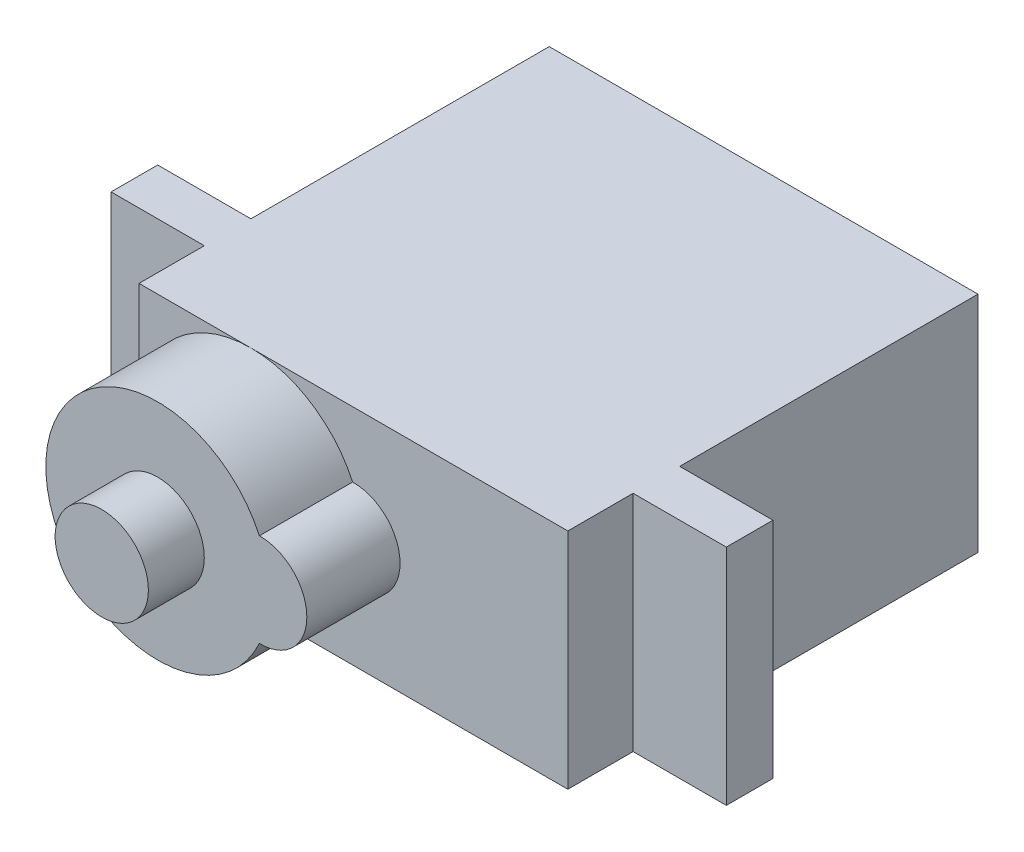
ISO-10303-21;
HEADER;
FILE_DESCRIPTION(('STEP AP214'),'2;1');
FILE_NAME('part.step','',(''),(''),'','','');
FILE_SCHEMA(('AUTOMOTIVE_DESIGN { 1 0 10303 214 1 1 1 1 }'));
ENDSEC;
DATA;
#1=APPLICATION_CONTEXT('core data for automotive mechanical design processes');
#2=APPLICATION_PROTOCOL_DEFINITION('international standard','automotive_design',2000,#1);
#3=PRODUCT_CONTEXT('',#1,'mechanical');
#4=PRODUCT('Part','Part','',(#3));
#5=PRODUCT_RELATED_PRODUCT_CATEGORY('part','',(#4));
#6=PRODUCT_DEFINITION_FORMATION('','',#4);
#7=PRODUCT_DEFINITION_CONTEXT('part definition',#1,'design');
#8=PRODUCT_DEFINITION('design','',#6,#7);
#9=PRODUCT_DEFINITION_SHAPE('','',#8);
#10=(LENGTH_UNIT() NAMED_UNIT(*) SI_UNIT(.MILLI.,.METRE.));
#11=(NAMED_UNIT(*) PLANE_ANGLE_UNIT() SI_UNIT($,.RADIAN.));
#12=(NAMED_UNIT(*) SI_UNIT($,.STERADIAN.) SOLID_ANGLE_UNIT());
#13=UNCERTAINTY_MEASURE_WITH_UNIT(LENGTH_MEASURE(1.E-05),#10,'distance_accuracy_value','');
#14=(GEOMETRIC_REPRESENTATION_CONTEXT(3) GLOBAL_UNCERTAINTY_ASSIGNED_CONTEXT((#13)) GLOBAL_UNIT_ASSIGNED_CONTEXT((#10,
#11,#12)) REPRESENTATION_CONTEXT('',''));
#15=CARTESIAN_POINT('',(0.,0.,0.));
#16=DIRECTION('',(0.,0.,1.));
#17=DIRECTION('',(1.,0.,0.));
#18=AXIS2_PLACEMENT_3D('',#15,#16,#17);
#19=CARTESIAN_POINT('',(11.5,-6.,22.));
#20=DIRECTION('',(-1.,0.,0.));
#21=DIRECTION('',(0.,0.,1.));
#22=AXIS2_PLACEMENT_3D('',#19,#20,#21);
#23=PLANE('',#22);
#24=DIRECTION('',(0.,0.,-1.));
#25=VECTOR('',#24,1.);
#26=CARTESIAN_POINT('',(11.5,-6.,22.));
#27=LINE('',#26,#25);
#28=CARTESIAN_POINT('',(11.5,-6.,22.));
#29=VERTEX_POINT('',#28);
#30=CARTESIAN_POINT('',(11.5,-6.,18.5));
#31=VERTEX_POINT('',#30);
#32=EDGE_CURVE('E253',#29,#31,#27,.T.);
#33=ORIENTED_EDGE('',*,*,#32,.T.);
#34=DIRECTION('',(0.,1.,0.));
#35=VECTOR('',#34,1.);
#36=CARTESIAN_POINT('',(11.5,6.,18.5));
#37=LINE('',#36,#35);
#38=CARTESIAN_POINT('',(11.5,6.,18.5));
#39=VERTEX_POINT('',#38);
#40=EDGE_CURVE('E155',#31,#39,#37,.T.);
#41=ORIENTED_EDGE('',*,*,#40,.T.);
#42=DIRECTION('',(0.,0.,-1.));
#43=VECTOR('',#42,1.);
#44=CARTESIAN_POINT('',(11.5,6.,22.));
#45=LINE('',#44,#43);
#46=CARTESIAN_POINT('',(11.5,6.,22.));
#47=VERTEX_POINT('',#46);
#48=EDGE_CURVE('E39',#47,#39,#45,.T.);
#49=ORIENTED_EDGE('',*,*,#48,.F.);
#50=DIRECTION('',(0.,1.,0.));
#51=VECTOR('',#50,1.);
#52=CARTESIAN_POINT('',(11.5,-6.,22.));
#53=LINE('',#52,#51);
#54=EDGE_CURVE('E227',#29,#47,#53,.T.);
#55=ORIENTED_EDGE('',*,*,#54,.F.);
#56=EDGE_LOOP('',(#33,#41,#49,#55));
#57=FACE_BOUND('',#56,.T.);
#58=ADVANCED_FACE('F35',(#57),#23,.F.);
#59=CARTESIAN_POINT('',(-11.5,-6.,22.));
#60=DIRECTION('',(1.,0.,0.));
#61=DIRECTION('',(0.,0.,-1.));
#62=AXIS2_PLACEMENT_3D('',#59,#60,#61);
#63=PLANE('',#62);
#64=DIRECTION('',(0.,1.,0.));
#65=VECTOR('',#64,1.);
#66=CARTESIAN_POINT('',(-11.5,6.,18.5));
#67=LINE('',#66,#65);
#68=CARTESIAN_POINT('',(-11.5,-6.,18.5));
#69=VERTEX_POINT('',#68);
#70=CARTESIAN_POINT('',(-11.5,6.,18.5));
#71=VERTEX_POINT('',#70);
#72=EDGE_CURVE('E159',#69,#71,#67,.T.);
#73=ORIENTED_EDGE('',*,*,#72,.F.);
#74=DIRECTION('',(0.,0.,-1.));
#75=VECTOR('',#74,1.);
#76=CARTESIAN_POINT('',(-11.5,-6.,22.));
#77=LINE('',#76,#75);
#78=CARTESIAN_POINT('',(-11.5,-6.,22.));
#79=VERTEX_POINT('',#78);
#80=EDGE_CURVE('E256',#79,#69,#77,.T.);
#81=ORIENTED_EDGE('',*,*,#80,.F.);
#82=DIRECTION('',(0.,-1.,0.));
#83=VECTOR('',#82,1.);
#84=CARTESIAN_POINT('',(-11.5,-6.,22.));
#85=LINE('',#84,#83);
#86=CARTESIAN_POINT('',(-11.5,0.,22.));
#87=VERTEX_POINT('',#86);
#88=EDGE_CURVE('E235',#87,#79,#85,.T.);
#89=ORIENTED_EDGE('',*,*,#88,.F.);
#90=CARTESIAN_POINT('',(-11.5,6.,22.));
#91=VERTEX_POINT('',#90);
#92=EDGE_CURVE('E236',#91,#87,#85,.T.);
#93=ORIENTED_EDGE('',*,*,#92,.F.);
#94=DIRECTION('',(0.,0.,-1.));
#95=VECTOR('',#94,1.);
#96=CARTESIAN_POINT('',(-11.5,6.,22.));
#97=LINE('',#96,#95);
#98=EDGE_CURVE('E259',#91,#71,#97,.T.);
#99=ORIENTED_EDGE('',*,*,#98,.T.);
#100=EDGE_LOOP('',(#73,#81,#89,#93,#99));
#101=FACE_BOUND('',#100,.T.);
#102=ADVANCED_FACE('F325',(#101),#63,.F.);
#103=DIRECTION('',(0.,-1.,0.));
#104=VECTOR('',#103,1.);
#105=CARTESIAN_POINT('',(-11.5,6.,16.));
#106=LINE('',#105,#104);
#107=CARTESIAN_POINT('',(-11.5,6.,16.));
#108=VERTEX_POINT('',#107);
#109=CARTESIAN_POINT('',(-11.5,-6.,16.));
#110=VERTEX_POINT('',#109);
#111=EDGE_CURVE('E189',#108,#110,#106,.T.);
#112=ORIENTED_EDGE('',*,*,#111,.F.);
#113=CARTESIAN_POINT('',(-11.5,6.,0.));
#114=VERTEX_POINT('',#113);
#115=EDGE_CURVE('E258',#108,#114,#97,.T.);
#116=ORIENTED_EDGE('',*,*,#115,.T.);
#117=DIRECTION('',(0.,-1.,0.));
#118=VECTOR('',#117,1.);
#119=CARTESIAN_POINT('',(-11.5,-6.,0.));
#120=LINE('',#119,#118);
#121=CARTESIAN_POINT('',(-11.5,-6.,0.));
#122=VERTEX_POINT('',#121);
#123=EDGE_CURVE('E249',#114,#122,#120,.T.);
#124=ORIENTED_EDGE('',*,*,#123,.T.);
#125=EDGE_CURVE('E255',#110,#122,#77,.T.);
#126=ORIENTED_EDGE('',*,*,#125,.F.);
#127=EDGE_LOOP('',(#112,#116,#124,#126));
#128=FACE_BOUND('',#127,.T.);
#129=ADVANCED_FACE('F269',(#128),#63,.F.);
#130=CARTESIAN_POINT('',(0.,0.,22.));
#131=DIRECTION('',(0.,0.,-1.));
#132=DIRECTION('',(-1.,0.,0.));
#133=AXIS2_PLACEMENT_3D('',#130,#131,#132);
#134=PLANE('',#133);
#135=CARTESIAN_POINT('',(-5.5,0.,22.));
#136=DIRECTION('',(0.,0.,1.));
#137=DIRECTION('',(1.,0.,0.));
#138=AXIS2_PLACEMENT_3D('',#135,#136,#137);
#139=CIRCLE('',#138,6.);
#140=CARTESIAN_POINT('',(-0.0454545454545473,2.49958674270319,22.));
#141=VERTEX_POINT('',#140);
#142=CARTESIAN_POINT('',(-5.5,6.,22.));
#143=VERTEX_POINT('',#142);
#144=EDGE_CURVE('E207',#141,#143,#139,.T.);
#145=ORIENTED_EDGE('',*,*,#144,.F.);
#146=CARTESIAN_POINT('',(0.,0.,22.));
#147=DIRECTION('',(0.,0.,1.));
#148=DIRECTION('',(1.,0.,0.));
#149=AXIS2_PLACEMENT_3D('',#146,#147,#148);
#150=CIRCLE('',#149,2.5);
#151=CARTESIAN_POINT('',(-0.0454545454545473,-2.49958674270319,22.));
#152=VERTEX_POINT('',#151);
#153=EDGE_CURVE('E213',#152,#141,#150,.T.);
#154=ORIENTED_EDGE('',*,*,#153,.F.);
#155=CARTESIAN_POINT('',(-5.5,-6.,22.));
#156=VERTEX_POINT('',#155);
#157=EDGE_CURVE('E218',#156,#152,#139,.T.);
#158=ORIENTED_EDGE('',*,*,#157,.F.);
#159=DIRECTION('',(1.,0.,0.));
#160=VECTOR('',#159,1.);
#161=CARTESIAN_POINT('',(-11.5,-6.,22.));
#162=LINE('',#161,#160);
#163=EDGE_CURVE('E239',#156,#29,#162,.T.);
#164=ORIENTED_EDGE('',*,*,#163,.T.);
#165=ORIENTED_EDGE('',*,*,#54,.T.);
#166=DIRECTION('',(-1.,0.,0.));
#167=VECTOR('',#166,1.);
#168=CARTESIAN_POINT('',(-11.5,6.,22.));
#169=LINE('',#168,#167);
#170=EDGE_CURVE('E232',#47,#143,#169,.T.);
#171=ORIENTED_EDGE('',*,*,#170,.T.);
#172=EDGE_LOOP('',(#145,#154,#158,#164,#165,#171));
#173=FACE_BOUND('',#172,.T.);
#174=ADVANCED_FACE('F304',(#173),#134,.F.);
#175=EDGE_CURVE('E44',#143,#87,#139,.T.);
#176=ORIENTED_EDGE('',*,*,#175,.F.);
#177=EDGE_CURVE('E230',#143,#91,#169,.T.);
#178=ORIENTED_EDGE('',*,*,#177,.T.);
#179=ORIENTED_EDGE('',*,*,#92,.T.);
#180=EDGE_LOOP('',(#176,#178,#179));
#181=FACE_BOUND('',#180,.T.);
#182=ADVANCED_FACE('F303',(#181),#134,.F.);
#183=CARTESIAN_POINT('',(11.5,6.,16.));
#184=VERTEX_POINT('',#183);
#185=CARTESIAN_POINT('',(11.5,6.,0.));
#186=VERTEX_POINT('',#185);
#187=EDGE_CURVE('E261',#184,#186,#45,.T.);
#188=ORIENTED_EDGE('',*,*,#187,.F.);
#189=DIRECTION('',(0.,-1.,0.));
#190=VECTOR('',#189,1.);
#191=CARTESIAN_POINT('',(11.5,6.,16.));
#192=LINE('',#191,#190);
#193=CARTESIAN_POINT('',(11.5,-6.,16.));
#194=VERTEX_POINT('',#193);
#195=EDGE_CURVE('E168',#184,#194,#192,.T.);
#196=ORIENTED_EDGE('',*,*,#195,.T.);
#197=CARTESIAN_POINT('',(11.5,-6.,0.));
#198=VERTEX_POINT('',#197);
#199=EDGE_CURVE('E243',#194,#198,#27,.T.);
#200=ORIENTED_EDGE('',*,*,#199,.T.);
#201=DIRECTION('',(0.,1.,0.));
#202=VECTOR('',#201,1.);
#203=CARTESIAN_POINT('',(11.5,-6.,0.));
#204=LINE('',#203,#202);
#205=EDGE_CURVE('E226',#198,#186,#204,.T.);
#206=ORIENTED_EDGE('',*,*,#205,.T.);
#207=EDGE_LOOP('',(#188,#196,#200,#206));
#208=FACE_BOUND('',#207,.T.);
#209=ADVANCED_FACE('F37',(#208),#23,.F.);
#210=CARTESIAN_POINT('',(-11.5,6.,22.));
#211=DIRECTION('',(0.,-1.,0.));
#212=DIRECTION('',(0.,0.,-1.));
#213=AXIS2_PLACEMENT_3D('',#210,#211,#212);
#214=PLANE('',#213);
#215=DIRECTION('',(-1.,0.,0.));
#216=VECTOR('',#215,1.);
#217=CARTESIAN_POINT('',(-11.5,6.,0.));
#218=LINE('',#217,#216);
#219=EDGE_CURVE('E246',#186,#114,#218,.T.);
#220=ORIENTED_EDGE('',*,*,#219,.T.);
#221=ORIENTED_EDGE('',*,*,#115,.F.);
#222=DIRECTION('',(1.,0.,0.));
#223=VECTOR('',#222,1.);
#224=CARTESIAN_POINT('',(-16.5,6.,16.));
#225=LINE('',#224,#223);
#226=CARTESIAN_POINT('',(-16.5,6.,16.));
#227=VERTEX_POINT('',#226);
#228=EDGE_CURVE('E201',#227,#108,#225,.T.);
#229=ORIENTED_EDGE('',*,*,#228,.F.);
#230=DIRECTION('',(0.,0.,-1.));
#231=VECTOR('',#230,1.);
#232=CARTESIAN_POINT('',(-16.5,6.,18.5));
#233=LINE('',#232,#231);
#234=CARTESIAN_POINT('',(-16.5,6.,18.5));
#235=VERTEX_POINT('',#234);
#236=EDGE_CURVE('E188',#235,#227,#233,.T.);
#237=ORIENTED_EDGE('',*,*,#236,.F.);
#238=DIRECTION('',(1.,0.,0.));
#239=VECTOR('',#238,1.);
#240=CARTESIAN_POINT('',(-16.5,6.,18.5));
#241=LINE('',#240,#239);
#242=EDGE_CURVE('E203',#235,#71,#241,.T.);
#243=ORIENTED_EDGE('',*,*,#242,.T.);
#244=ORIENTED_EDGE('',*,*,#98,.F.);
#245=ORIENTED_EDGE('',*,*,#177,.F.);
#246=ORIENTED_EDGE('',*,*,#170,.F.);
#247=ORIENTED_EDGE('',*,*,#48,.T.);
#248=DIRECTION('',(-1.,0.,0.));
#249=VECTOR('',#248,1.);
#250=CARTESIAN_POINT('',(16.5,6.,18.5));
#251=LINE('',#250,#249);
#252=CARTESIAN_POINT('',(16.5,6.,18.5));
#253=VERTEX_POINT('',#252);
#254=EDGE_CURVE('E178',#253,#39,#251,.T.);
#255=ORIENTED_EDGE('',*,*,#254,.F.);
#256=DIRECTION('',(0.,0.,-1.));
#257=VECTOR('',#256,1.);
#258=CARTESIAN_POINT('',(16.5,6.,18.5));
#259=LINE('',#258,#257);
#260=CARTESIAN_POINT('',(16.5,6.,16.));
#261=VERTEX_POINT('',#260);
#262=EDGE_CURVE('E167',#253,#261,#259,.T.);
#263=ORIENTED_EDGE('',*,*,#262,.T.);
#264=DIRECTION('',(-1.,0.,0.));
#265=VECTOR('',#264,1.);
#266=CARTESIAN_POINT('',(16.5,6.,16.));
#267=LINE('',#266,#265);
#268=EDGE_CURVE('E182',#261,#184,#267,.T.);
#269=ORIENTED_EDGE('',*,*,#268,.T.);
#270=ORIENTED_EDGE('',*,*,#187,.T.);
#271=EDGE_LOOP('',(#220,#221,#229,#237,#243,#244,#245,#246,#247,#255,#263,#269,#270));
#272=FACE_BOUND('',#271,.T.);
#273=ADVANCED_FACE('F276',(#272),#214,.F.);
#274=CARTESIAN_POINT('',(-11.5,-6.,22.));
#275=DIRECTION('',(0.,1.,0.));
#276=DIRECTION('',(0.,0.,1.));
#277=AXIS2_PLACEMENT_3D('',#274,#275,#276);
#278=PLANE('',#277);
#279=DIRECTION('',(1.,0.,0.));
#280=VECTOR('',#279,1.);
#281=CARTESIAN_POINT('',(-11.5,-6.,0.));
#282=LINE('',#281,#280);
#283=EDGE_CURVE('E231',#122,#198,#282,.T.);
#284=ORIENTED_EDGE('',*,*,#283,.T.);
#285=ORIENTED_EDGE('',*,*,#199,.F.);
#286=DIRECTION('',(-1.,0.,0.));
#287=VECTOR('',#286,1.);
#288=CARTESIAN_POINT('',(16.5,-6.,16.));
#289=LINE('',#288,#287);
#290=CARTESIAN_POINT('',(16.5,-6.,16.));
#291=VERTEX_POINT('',#290);
#292=EDGE_CURVE('E52',#291,#194,#289,.T.);
#293=ORIENTED_EDGE('',*,*,#292,.F.);
#294=DIRECTION('',(0.,0.,1.));
#295=VECTOR('',#294,1.);
#296=CARTESIAN_POINT('',(16.5,-6.,18.5));
#297=LINE('',#296,#295);
#298=CARTESIAN_POINT('',(16.5,-6.,18.5));
#299=VERTEX_POINT('',#298);
#300=EDGE_CURVE('E165',#291,#299,#297,.T.);
#301=ORIENTED_EDGE('',*,*,#300,.T.);
#302=DIRECTION('',(-1.,0.,0.));
#303=VECTOR('',#302,1.);
#304=CARTESIAN_POINT('',(16.5,-6.,18.5));
#305=LINE('',#304,#303);
#306=EDGE_CURVE('E149',#299,#31,#305,.T.);
#307=ORIENTED_EDGE('',*,*,#306,.T.);
#308=ORIENTED_EDGE('',*,*,#32,.F.);
#309=ORIENTED_EDGE('',*,*,#163,.F.);
#310=EDGE_CURVE('E240',#79,#156,#162,.T.);
#311=ORIENTED_EDGE('',*,*,#310,.F.);
#312=ORIENTED_EDGE('',*,*,#80,.T.);
#313=DIRECTION('',(1.,0.,0.));
#314=VECTOR('',#313,1.);
#315=CARTESIAN_POINT('',(-16.5,-6.,18.5));
#316=LINE('',#315,#314);
#317=CARTESIAN_POINT('',(-16.5,-6.,18.5));
#318=VERTEX_POINT('',#317);
#319=EDGE_CURVE('E195',#318,#69,#316,.T.);
#320=ORIENTED_EDGE('',*,*,#319,.F.);
#321=DIRECTION('',(0.,0.,1.));
#322=VECTOR('',#321,1.);
#323=CARTESIAN_POINT('',(-16.5,-6.,18.5));
#324=LINE('',#323,#322);
#325=CARTESIAN_POINT('',(-16.5,-6.,16.));
#326=VERTEX_POINT('',#325);
#327=EDGE_CURVE('E193',#326,#318,#324,.T.);
#328=ORIENTED_EDGE('',*,*,#327,.F.);
#329=DIRECTION('',(1.,0.,0.));
#330=VECTOR('',#329,1.);
#331=CARTESIAN_POINT('',(-16.5,-6.,16.));
#332=LINE('',#331,#330);
#333=EDGE_CURVE('E60',#326,#110,#332,.T.);
#334=ORIENTED_EDGE('',*,*,#333,.T.);
#335=ORIENTED_EDGE('',*,*,#125,.T.);
#336=EDGE_LOOP('',(#284,#285,#293,#301,#307,#308,#309,#311,#312,#320,#328,#334,#335));
#337=FACE_BOUND('',#336,.T.);
#338=ADVANCED_FACE('F171',(#337),#278,.F.);
#339=EDGE_CURVE('E293',#87,#156,#139,.T.);
#340=ORIENTED_EDGE('',*,*,#339,.F.);
#341=ORIENTED_EDGE('',*,*,#88,.T.);
#342=ORIENTED_EDGE('',*,*,#310,.T.);
#343=EDGE_LOOP('',(#340,#341,#342));
#344=FACE_BOUND('',#343,.T.);
#345=ADVANCED_FACE('F292',(#344),#134,.F.);
#346=CARTESIAN_POINT('',(0.,0.,0.));
#347=DIRECTION('',(0.,0.,-1.));
#348=DIRECTION('',(-1.,0.,0.));
#349=AXIS2_PLACEMENT_3D('',#346,#347,#348);
#350=PLANE('',#349);
#351=ORIENTED_EDGE('',*,*,#205,.F.);
#352=ORIENTED_EDGE('',*,*,#283,.F.);
#353=ORIENTED_EDGE('',*,*,#123,.F.);
#354=ORIENTED_EDGE('',*,*,#219,.F.);
#355=EDGE_LOOP('',(#351,#352,#353,#354));
#356=FACE_BOUND('',#355,.T.);
#357=ADVANCED_FACE('F280',(#356),#350,.T.);
#358=CARTESIAN_POINT('',(-5.5,0.,27.));
#359=DIRECTION('',(0.,0.,-1.));
#360=DIRECTION('',(-1.,0.,0.));
#361=AXIS2_PLACEMENT_3D('',#358,#359,#360);
#362=CYLINDRICAL_SURFACE('',#361,6.);
#363=ORIENTED_EDGE('',*,*,#144,.T.);
#364=ORIENTED_EDGE('',*,*,#175,.T.);
#365=ORIENTED_EDGE('',*,*,#339,.T.);
#366=ORIENTED_EDGE('',*,*,#157,.T.);
#367=DIRECTION('',(0.,0.,-1.));
#368=VECTOR('',#367,1.);
#369=CARTESIAN_POINT('',(-0.0454545454545473,-2.49958674270319,27.));
#370=LINE('',#369,#368);
#371=CARTESIAN_POINT('',(-0.0454545454545473,-2.49958674270319,27.));
#372=VERTEX_POINT('',#371);
#373=EDGE_CURVE('E223',#372,#152,#370,.T.);
#374=ORIENTED_EDGE('',*,*,#373,.F.);
#375=CARTESIAN_POINT('',(-5.5,0.,27.));
#376=DIRECTION('',(0.,0.,1.));
#377=DIRECTION('',(1.,0.,0.));
#378=AXIS2_PLACEMENT_3D('',#375,#376,#377);
#379=CIRCLE('',#378,6.);
#380=CARTESIAN_POINT('',(-0.0454545454545473,2.49958674270319,27.));
#381=VERTEX_POINT('',#380);
#382=EDGE_CURVE('E209',#381,#372,#379,.T.);
#383=ORIENTED_EDGE('',*,*,#382,.F.);
#384=DIRECTION('',(0.,0.,-1.));
#385=VECTOR('',#384,1.);
#386=CARTESIAN_POINT('',(-0.0454545454545473,2.49958674270319,27.));
#387=LINE('',#386,#385);
#388=EDGE_CURVE('E215',#381,#141,#387,.T.);
#389=ORIENTED_EDGE('',*,*,#388,.T.);
#390=EDGE_LOOP('',(#363,#364,#365,#366,#374,#383,#389));
#391=FACE_BOUND('',#390,.T.);
#392=ADVANCED_FACE('F299',(#391),#362,.T.);
#393=CARTESIAN_POINT('',(0.,0.,27.));
#394=DIRECTION('',(0.,0.,-1.));
#395=DIRECTION('',(-1.,0.,0.));
#396=AXIS2_PLACEMENT_3D('',#393,#394,#395);
#397=CYLINDRICAL_SURFACE('',#396,2.5);
#398=ORIENTED_EDGE('',*,*,#153,.T.);
#399=ORIENTED_EDGE('',*,*,#388,.F.);
#400=CARTESIAN_POINT('',(0.,0.,27.));
#401=DIRECTION('',(0.,0.,1.));
#402=DIRECTION('',(1.,0.,0.));
#403=AXIS2_PLACEMENT_3D('',#400,#401,#402);
#404=CIRCLE('',#403,2.5);
#405=EDGE_CURVE('E212',#372,#381,#404,.T.);
#406=ORIENTED_EDGE('',*,*,#405,.F.);
#407=ORIENTED_EDGE('',*,*,#373,.T.);
#408=EDGE_LOOP('',(#398,#399,#406,#407));
#409=FACE_BOUND('',#408,.T.);
#410=ADVANCED_FACE('F307',(#409),#397,.T.);
#411=CARTESIAN_POINT('',(0.,0.,27.));
#412=DIRECTION('',(0.,0.,1.));
#413=DIRECTION('',(1.,0.,0.));
#414=AXIS2_PLACEMENT_3D('',#411,#412,#413);
#415=PLANE('',#414);
#416=CARTESIAN_POINT('',(-5.5,0.,27.));
#417=DIRECTION('',(0.,0.,1.));
#418=DIRECTION('',(1.,0.,0.));
#419=AXIS2_PLACEMENT_3D('',#416,#417,#418);
#420=CIRCLE('',#419,2.5);
#421=CARTESIAN_POINT('',(-3.,0.,27.));
#422=VERTEX_POINT('',#421);
#423=EDGE_CURVE('E11',#422,#422,#420,.T.);
#424=ORIENTED_EDGE('',*,*,#423,.F.);
#425=EDGE_LOOP('',(#424));
#426=FACE_BOUND('',#425,.T.);
#427=ORIENTED_EDGE('',*,*,#382,.T.);
#428=ORIENTED_EDGE('',*,*,#405,.T.);
#429=EDGE_LOOP('',(#427,#428));
#430=FACE_BOUND('',#429,.T.);
#431=ADVANCED_FACE('F310',(#426,#430),#415,.T.);
#432=CARTESIAN_POINT('',(-5.5,0.,30.));
#433=DIRECTION('',(0.,0.,-1.));
#434=DIRECTION('',(-1.,0.,0.));
#435=AXIS2_PLACEMENT_3D('',#432,#433,#434);
#436=CYLINDRICAL_SURFACE('',#435,2.5);
#437=CARTESIAN_POINT('',(-5.5,0.,30.));
#438=DIRECTION('',(0.,0.,1.));
#439=DIRECTION('',(1.,0.,0.));
#440=AXIS2_PLACEMENT_3D('',#437,#438,#439);
#441=CIRCLE('',#440,2.5);
#442=CARTESIAN_POINT('',(-3.,0.,30.));
#443=VERTEX_POINT('',#442);
#444=EDGE_CURVE('E205',#443,#443,#441,.T.);
#445=ORIENTED_EDGE('',*,*,#444,.F.);
#446=EDGE_LOOP('',(#445));
#447=FACE_BOUND('',#446,.T.);
#448=ORIENTED_EDGE('',*,*,#423,.T.);
#449=EDGE_LOOP('',(#448));
#450=FACE_BOUND('',#449,.T.);
#451=ADVANCED_FACE('F312',(#447,#450),#436,.T.);
#452=CARTESIAN_POINT('',(0.,0.,30.));
#453=DIRECTION('',(0.,0.,1.));
#454=DIRECTION('',(1.,0.,0.));
#455=AXIS2_PLACEMENT_3D('',#452,#453,#454);
#456=PLANE('',#455);
#457=ORIENTED_EDGE('',*,*,#444,.T.);
#458=EDGE_LOOP('',(#457));
#459=FACE_BOUND('',#458,.T.);
#460=ADVANCED_FACE('F319',(#459),#456,.T.);
#461=CARTESIAN_POINT('',(-16.5,6.,18.5));
#462=DIRECTION('',(0.,0.,-1.));
#463=DIRECTION('',(-1.,0.,0.));
#464=AXIS2_PLACEMENT_3D('',#461,#462,#463);
#465=PLANE('',#464);
#466=ORIENTED_EDGE('',*,*,#72,.T.);
#467=ORIENTED_EDGE('',*,*,#242,.F.);
#468=DIRECTION('',(0.,1.,0.));
#469=VECTOR('',#468,1.);
#470=CARTESIAN_POINT('',(-16.5,6.,18.5));
#471=LINE('',#470,#469);
#472=EDGE_CURVE('E185',#318,#235,#471,.T.);
#473=ORIENTED_EDGE('',*,*,#472,.F.);
#474=ORIENTED_EDGE('',*,*,#319,.T.);
#475=EDGE_LOOP('',(#466,#467,#473,#474));
#476=FACE_BOUND('',#475,.T.);
#477=ADVANCED_FACE('F385',(#476),#465,.F.);
#478=CARTESIAN_POINT('',(-16.5,6.,16.));
#479=DIRECTION('',(0.,0.,1.));
#480=DIRECTION('',(1.,0.,0.));
#481=AXIS2_PLACEMENT_3D('',#478,#479,#480);
#482=PLANE('',#481);
#483=ORIENTED_EDGE('',*,*,#111,.T.);
#484=ORIENTED_EDGE('',*,*,#333,.F.);
#485=DIRECTION('',(0.,-1.,0.));
#486=VECTOR('',#485,1.);
#487=CARTESIAN_POINT('',(-16.5,6.,16.));
#488=LINE('',#487,#486);
#489=EDGE_CURVE('E191',#227,#326,#488,.T.);
#490=ORIENTED_EDGE('',*,*,#489,.F.);
#491=ORIENTED_EDGE('',*,*,#228,.T.);
#492=EDGE_LOOP('',(#483,#484,#490,#491));
#493=FACE_BOUND('',#492,.T.);
#494=ADVANCED_FACE('F374',(#493),#482,.F.);
#495=CARTESIAN_POINT('',(-16.5,0.,0.));
#496=DIRECTION('',(1.,0.,0.));
#497=DIRECTION('',(0.,0.,-1.));
#498=AXIS2_PLACEMENT_3D('',#495,#496,#497);
#499=PLANE('',#498);
#500=ORIENTED_EDGE('',*,*,#472,.T.);
#501=ORIENTED_EDGE('',*,*,#236,.T.);
#502=ORIENTED_EDGE('',*,*,#489,.T.);
#503=ORIENTED_EDGE('',*,*,#327,.T.);
#504=EDGE_LOOP('',(#500,#501,#502,#503));
#505=FACE_BOUND('',#504,.T.);
#506=ADVANCED_FACE('F370',(#505),#499,.F.);
#507=CARTESIAN_POINT('',(16.5,6.,18.5));
#508=DIRECTION('',(0.,0.,1.));
#509=DIRECTION('',(1.,0.,0.));
#510=AXIS2_PLACEMENT_3D('',#507,#508,#509);
#511=PLANE('',#510);
#512=ORIENTED_EDGE('',*,*,#40,.F.);
#513=ORIENTED_EDGE('',*,*,#306,.F.);
#514=DIRECTION('',(0.,1.,0.));
#515=VECTOR('',#514,1.);
#516=CARTESIAN_POINT('',(16.5,6.,18.5));
#517=LINE('',#516,#515);
#518=EDGE_CURVE('E152',#299,#253,#517,.T.);
#519=ORIENTED_EDGE('',*,*,#518,.T.);
#520=ORIENTED_EDGE('',*,*,#254,.T.);
#521=EDGE_LOOP('',(#512,#513,#519,#520));
#522=FACE_BOUND('',#521,.T.);
#523=ADVANCED_FACE('F151',(#522),#511,.T.);
#524=CARTESIAN_POINT('',(16.5,6.,16.));
#525=DIRECTION('',(0.,0.,-1.));
#526=DIRECTION('',(-1.,0.,0.));
#527=AXIS2_PLACEMENT_3D('',#524,#525,#526);
#528=PLANE('',#527);
#529=ORIENTED_EDGE('',*,*,#195,.F.);
#530=ORIENTED_EDGE('',*,*,#268,.F.);
#531=DIRECTION('',(0.,-1.,0.));
#532=VECTOR('',#531,1.);
#533=CARTESIAN_POINT('',(16.5,6.,16.));
#534=LINE('',#533,#532);
#535=EDGE_CURVE('E173',#261,#291,#534,.T.);
#536=ORIENTED_EDGE('',*,*,#535,.T.);
#537=ORIENTED_EDGE('',*,*,#292,.T.);
#538=EDGE_LOOP('',(#529,#530,#536,#537));
#539=FACE_BOUND('',#538,.T.);
#540=ADVANCED_FACE('F282',(#539),#528,.T.);
#541=CARTESIAN_POINT('',(16.5,0.,0.));
#542=DIRECTION('',(-1.,0.,0.));
#543=DIRECTION('',(0.,0.,-1.));
#544=AXIS2_PLACEMENT_3D('',#541,#542,#543);
#545=PLANE('',#544);
#546=ORIENTED_EDGE('',*,*,#518,.F.);
#547=ORIENTED_EDGE('',*,*,#300,.F.);
#548=ORIENTED_EDGE('',*,*,#535,.F.);
#549=ORIENTED_EDGE('',*,*,#262,.F.);
#550=EDGE_LOOP('',(#546,#547,#548,#549));
#551=FACE_BOUND('',#550,.T.);
#552=ADVANCED_FACE('F163',(#551),#545,.F.);
#553=CLOSED_SHELL('',(#58,#102,#129,#174,#182,#209,#273,#338,#345,#357,#392,#410,#431,#451,#460,
#477,#494,#506,#523,#540,#552));
#554=MANIFOLD_SOLID_BREP('B2',#553);
#555=ADVANCED_BREP_SHAPE_REPRESENTATION('',(#18,#554),#14);
#556=SHAPE_DEFINITION_REPRESENTATION(#9,#555);
ENDSEC;
END-ISO-10303-21;
